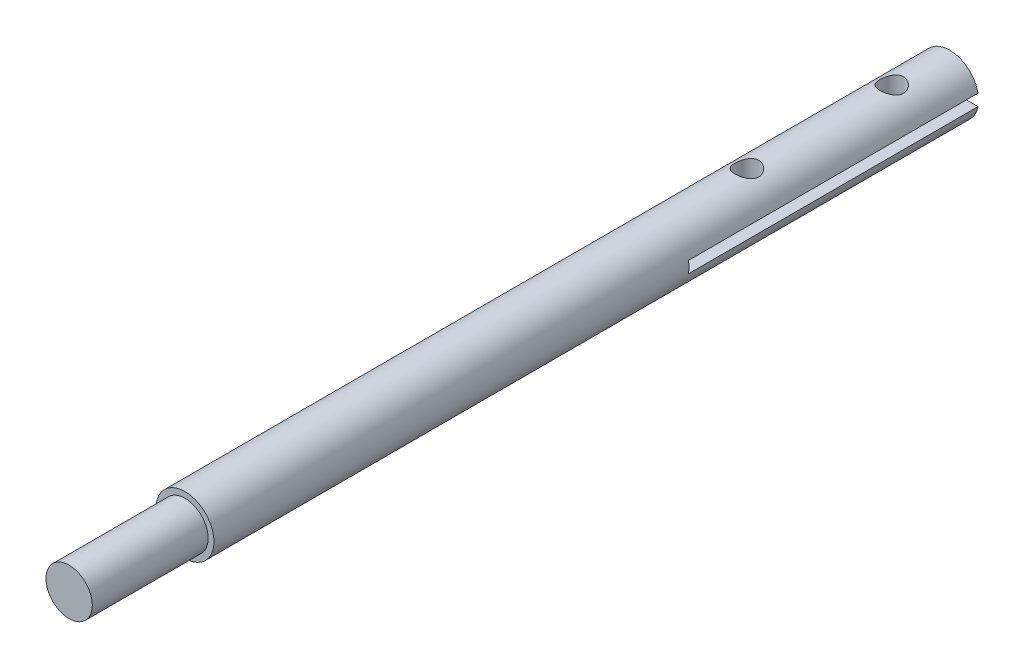
ISO-10303-21;
HEADER;
FILE_DESCRIPTION(('STEP AP214'),'2;1');
FILE_NAME('part.step','',(''),(''),'','','');
FILE_SCHEMA(('AUTOMOTIVE_DESIGN { 1 0 10303 214 1 1 1 1 }'));
ENDSEC;
DATA;
#1=APPLICATION_CONTEXT('core data for automotive mechanical design processes');
#2=APPLICATION_PROTOCOL_DEFINITION('international standard','automotive_design',2000,#1);
#3=PRODUCT_CONTEXT('',#1,'mechanical');
#4=PRODUCT('Part','Part','',(#3));
#5=PRODUCT_RELATED_PRODUCT_CATEGORY('part','',(#4));
#6=PRODUCT_DEFINITION_FORMATION('','',#4);
#7=PRODUCT_DEFINITION_CONTEXT('part definition',#1,'design');
#8=PRODUCT_DEFINITION('design','',#6,#7);
#9=PRODUCT_DEFINITION_SHAPE('','',#8);
#10=(LENGTH_UNIT() NAMED_UNIT(*) SI_UNIT(.MILLI.,.METRE.));
#11=(NAMED_UNIT(*) PLANE_ANGLE_UNIT() SI_UNIT($,.RADIAN.));
#12=(NAMED_UNIT(*) SI_UNIT($,.STERADIAN.) SOLID_ANGLE_UNIT());
#13=UNCERTAINTY_MEASURE_WITH_UNIT(LENGTH_MEASURE(1.E-05),#10,'distance_accuracy_value','');
#14=(GEOMETRIC_REPRESENTATION_CONTEXT(3) GLOBAL_UNCERTAINTY_ASSIGNED_CONTEXT((#13)) GLOBAL_UNIT_ASSIGNED_CONTEXT((#10,
#11,#12)) REPRESENTATION_CONTEXT('',''));
#15=CARTESIAN_POINT('',(0.,0.,0.));
#16=DIRECTION('',(0.,0.,1.));
#17=DIRECTION('',(1.,0.,0.));
#18=AXIS2_PLACEMENT_3D('',#15,#16,#17);
#19=CARTESIAN_POINT('',(0.,0.,152.));
#20=DIRECTION('',(0.,0.,-1.));
#21=DIRECTION('',(-1.,0.,0.));
#22=AXIS2_PLACEMENT_3D('',#19,#20,#21);
#23=CYLINDRICAL_SURFACE('',#22,5.);
#24=CARTESIAN_POINT('',(0.,5.,37.05));
#25=CARTESIAN_POINT('',(-0.109960088888995,4.99999162474761,37.0499887883828));
#26=CARTESIAN_POINT('',(-0.22010055786124,4.99633037283782,37.041100133019));
#27=CARTESIAN_POINT('',(-0.437266741365285,4.98203966344817,37.0058577990706));
#28=CARTESIAN_POINT('',(-0.544283398643791,4.97139171016134,36.9794577607932));
#29=CARTESIAN_POINT('',(-0.751707022834503,4.94427311737361,36.9103248814743));
#30=CARTESIAN_POINT('',(-0.85213478143757,4.92782195363244,36.8676466321715));
#31=CARTESIAN_POINT('',(-1.04431045171123,4.89070621857743,36.7673905713935));
#32=CARTESIAN_POINT('',(-1.1360611340093,4.87004299888606,36.7098175379704));
#33=CARTESIAN_POINT('',(-1.3129112576905,4.82544824059393,36.5784277911521));
#34=CARTESIAN_POINT('',(-1.39753009572435,4.80141189829074,36.5040000461978));
#35=CARTESIAN_POINT('',(-1.55349516200822,4.75324403175796,36.3423045644368));
#36=CARTESIAN_POINT('',(-1.6248346051593,4.72911246526888,36.2550303042697));
#37=CARTESIAN_POINT('',(-1.755544619026,4.68221302178201,36.0651127961902));
#38=CARTESIAN_POINT('',(-1.81418971857822,4.65956358527188,35.9619379531515));
#39=CARTESIAN_POINT('',(-1.9130783495842,4.61984764238022,35.7461231596069));
#40=CARTESIAN_POINT('',(-1.95333106246556,4.60277835161923,35.6334879649992));
#41=CARTESIAN_POINT('',(-2.01232406481144,4.57728595497806,35.4074786316426));
#42=CARTESIAN_POINT('',(-2.03198746852038,4.56849380770459,35.294388640851));
#43=CARTESIAN_POINT('',(-2.05212524729083,4.5594864349829,35.0661988528779));
#44=CARTESIAN_POINT('',(-2.05260973082374,4.5592666913512,34.9511001464188));
#45=CARTESIAN_POINT('',(-2.0350729213677,4.56711561624861,34.7312213081443));
#46=CARTESIAN_POINT('',(-2.01841429456452,4.57457398551408,34.6263063913018));
#47=CARTESIAN_POINT('',(-1.96934433297629,4.59591025231423,34.4209181208997));
#48=CARTESIAN_POINT('',(-1.93693009219314,4.60978933407564,34.320445590434));
#49=CARTESIAN_POINT('',(-1.85664243190718,4.64271345182265,34.1243011923068));
#50=CARTESIAN_POINT('',(-1.80845944677014,4.66186059779945,34.0287739466775));
#51=CARTESIAN_POINT('',(-1.69822024761073,4.70313793482963,33.8467972999446));
#52=CARTESIAN_POINT('',(-1.63615866376572,4.72526927919136,33.7603514316311));
#53=CARTESIAN_POINT('',(-1.49397721453326,4.77221891894988,33.5915693418189));
#54=CARTESIAN_POINT('',(-1.41279718537875,4.79710912429429,33.5101437251626));
#55=CARTESIAN_POINT('',(-1.23767977710518,4.84524390123744,33.3617623069151));
#56=CARTESIAN_POINT('',(-1.14373960235719,4.86848811051128,33.2948096845753));
#57=CARTESIAN_POINT('',(-0.94307604962629,4.91134852411871,33.1759968793123));
#58=CARTESIAN_POINT('',(-0.836119470977464,4.93087503363102,33.1244958136744));
#59=CARTESIAN_POINT('',(-0.614056114924541,4.96341578511297,33.0405347223468));
#60=CARTESIAN_POINT('',(-0.498953731554758,4.97643350796359,33.0080645174021));
#61=CARTESIAN_POINT('',(-0.271485319953805,4.99384610082279,32.9649667218565));
#62=CARTESIAN_POINT('',(-0.159387774592538,4.99872291337825,32.9531164008052));
#63=CARTESIAN_POINT('',(0.065290386269212,5.00083436123854,32.9479635357885));
#64=CARTESIAN_POINT('',(0.177870860072347,4.99807110304132,32.954655879295));
#65=CARTESIAN_POINT('',(0.394667808252847,4.98552673161979,32.9855132024052));
#66=CARTESIAN_POINT('',(0.499027059942423,4.97608675600825,33.0088292647144));
#67=CARTESIAN_POINT('',(0.702245688808083,4.95149823663536,33.071101375644));
#68=CARTESIAN_POINT('',(0.801104364199268,4.93634896636788,33.1100594147428));
#69=CARTESIAN_POINT('',(0.993959795962191,4.90121953471975,33.2037833004952));
#70=CARTESIAN_POINT('',(1.0877118542303,4.88110453737019,33.259000500707));
#71=CARTESIAN_POINT('',(1.26495296070549,4.83820450596423,33.3831775449952));
#72=CARTESIAN_POINT('',(1.34843776500182,4.81541837536033,33.452143041187));
#73=CARTESIAN_POINT('',(1.50884922434306,4.76768878573154,33.6074545106471));
#74=CARTESIAN_POINT('',(1.58492080944092,4.7427052349868,33.6946735960969));
#75=CARTESIAN_POINT('',(1.72157494851165,4.6948307682978,33.8810562450317));
#76=CARTESIAN_POINT('',(1.78215439034815,4.67194027340909,33.9802222025854));
#77=CARTESIAN_POINT('',(1.88664471859868,4.63074288498098,34.1895005166027));
#78=CARTESIAN_POINT('',(1.93034078664689,4.61249601142736,34.2997328059728));
#79=CARTESIAN_POINT('',(1.99819259878441,4.58351537382527,34.5269703528935));
#80=CARTESIAN_POINT('',(2.02236376652676,4.57277568040083,34.643970185984));
#81=CARTESIAN_POINT('',(2.04897041241061,4.56091140818714,34.8719668049263));
#82=CARTESIAN_POINT('',(2.0528999812502,4.55912616102851,34.9827557738081));
#83=CARTESIAN_POINT('',(2.0428743333798,4.56362741250793,35.2033430307127));
#84=CARTESIAN_POINT('',(2.02892166007729,4.56991276325777,35.3131414573846));
#85=CARTESIAN_POINT('',(1.9847689403231,4.58925153011183,35.5237036169474));
#86=CARTESIAN_POINT('',(1.95530467358879,4.60199754557495,35.6246525128866));
#87=CARTESIAN_POINT('',(1.88167179572287,4.63259024015567,35.8202044274074));
#88=CARTESIAN_POINT('',(1.83749908043773,4.65043834273087,35.9148056659159));
#89=CARTESIAN_POINT('',(1.73269683899259,4.69053110841601,36.1010660592811));
#90=CARTESIAN_POINT('',(1.67124993123014,4.71297307906766,36.1922220796592));
#91=CARTESIAN_POINT('',(1.53480828300677,4.75915396420042,36.3633973622575));
#92=CARTESIAN_POINT('',(1.45980908855853,4.78289330326979,36.4434129477978));
#93=CARTESIAN_POINT('',(1.29219113304724,4.8309783179901,36.5957566799648));
#94=CARTESIAN_POINT('',(1.19870962499975,4.85525129768707,36.6671628716104));
#95=CARTESIAN_POINT('',(1.00018198070987,4.89999732517489,36.7933104628778));
#96=CARTESIAN_POINT('',(0.895130570546059,4.92046862852728,36.8480442195198));
#97=CARTESIAN_POINT('',(0.678204217797162,4.95498686486783,36.938064817949));
#98=CARTESIAN_POINT('',(0.566480373896989,4.96913969112491,36.9736744080793));
#99=CARTESIAN_POINT('',(0.338135516339043,4.9898597892694,37.0252842715524));
#100=CARTESIAN_POINT('',(0.221531130647042,4.99645094005013,37.041346283702));
#101=CARTESIAN_POINT('',(0.0697228525015928,4.99963796102132,37.0491143522945));
#102=CARTESIAN_POINT('',(0.0348704961962966,5.00000265595644,37.0500035554233));
#103=CARTESIAN_POINT('',(0.,5.,37.05));
#104=B_SPLINE_CURVE_WITH_KNOTS('',3,(#24,#25,#26,#27,#28,#29,#30,#31,#32,#33,#34,#35,#36,#37,
#38,#39,#40,#41,#42,#43,#44,#45,#46,#47,#48,#49,#50,#51,#52,#53,#54,#55,#56,#57,#58,#59,#60,#61,
#62,#63,#64,#65,#66,#67,#68,#69,#70,#71,#72,#73,#74,#75,#76,#77,#78,#79,#80,#81,#82,#83,#84,#85,
#86,#87,#88,#89,#90,#91,#92,#93,#94,#95,#96,#97,#98,#99,#100,#101,#102,#103),.UNSPECIFIED.,.T.,
.F.,(4,2,2,2,2,2,2,2,2,2,2,2,2,2,2,2,2,2,2,2,2,2,2,2,2,2,2,2,2,2,2,2,2,2,2,2,2,2,2,4),(0.,
0.32978342689205,0.660443426826358,0.990004116450424,1.31945921811745,1.66364022554888,
2.00799661221837,2.36863620751076,2.72909557531711,3.07259406382618,3.41591150507755,
3.73389996746568,4.05194710257311,4.37665557788593,4.70148990545885,5.05282452028155,
5.40423623377219,5.76327522208258,6.12212199141179,6.45885503955892,6.79549525391494,
7.11607316626805,7.43669188585171,7.76721987322439,8.09788402651641,8.45145691735235,
8.80510077991834,9.16310673123037,9.52082959918418,9.85172568562769,10.1825747136438,
10.4989822282431,10.8154781053062,11.1506527276499,11.4859377068484,11.8445460682332,
12.2033185763632,12.5558291489523,12.9072234431145,13.0118042219155),.UNSPECIFIED.);
#105=CARTESIAN_POINT('',(0.,5.,37.05));
#106=VERTEX_POINT('',#105);
#107=EDGE_CURVE('E99',#106,#106,#104,.T.);
#108=ORIENTED_EDGE('',*,*,#107,.T.);
#109=EDGE_LOOP('',(#108));
#110=FACE_BOUND('',#109,.T.);
#111=CARTESIAN_POINT('',(0.,-5.,37.05));
#112=CARTESIAN_POINT('',(0.109960088888995,-4.99999162474761,37.0499887883828));
#113=CARTESIAN_POINT('',(0.22010055786124,-4.99633037283782,37.041100133019));
#114=CARTESIAN_POINT('',(0.437266741365285,-4.98203966344817,37.0058577990706));
#115=CARTESIAN_POINT('',(0.544283398643791,-4.97139171016134,36.9794577607932));
#116=CARTESIAN_POINT('',(0.751707022834503,-4.94427311737361,36.9103248814743));
#117=CARTESIAN_POINT('',(0.85213478143757,-4.92782195363244,36.8676466321715));
#118=CARTESIAN_POINT('',(1.04431045171123,-4.89070621857743,36.7673905713935));
#119=CARTESIAN_POINT('',(1.1360611340093,-4.87004299888606,36.7098175379704));
#120=CARTESIAN_POINT('',(1.3129112576905,-4.82544824059393,36.5784277911521));
#121=CARTESIAN_POINT('',(1.39753009572435,-4.80141189829074,36.5040000461978));
#122=CARTESIAN_POINT('',(1.55349516200822,-4.75324403175796,36.3423045644368));
#123=CARTESIAN_POINT('',(1.6248346051593,-4.72911246526888,36.2550303042697));
#124=CARTESIAN_POINT('',(1.755544619026,-4.68221302178201,36.0651127961902));
#125=CARTESIAN_POINT('',(1.81418971857822,-4.65956358527188,35.9619379531515));
#126=CARTESIAN_POINT('',(1.9130783495842,-4.61984764238022,35.7461231596069));
#127=CARTESIAN_POINT('',(1.95333106246556,-4.60277835161923,35.6334879649992));
#128=CARTESIAN_POINT('',(2.01232406481144,-4.57728595497806,35.4074786316426));
#129=CARTESIAN_POINT('',(2.03198746852038,-4.56849380770459,35.294388640851));
#130=CARTESIAN_POINT('',(2.05212524729083,-4.5594864349829,35.0661988528779));
#131=CARTESIAN_POINT('',(2.05260973082374,-4.5592666913512,34.9511001464188));
#132=CARTESIAN_POINT('',(2.0350729213677,-4.56711561624861,34.7312213081443));
#133=CARTESIAN_POINT('',(2.01841429456452,-4.57457398551408,34.6263063913018));
#134=CARTESIAN_POINT('',(1.96934433297629,-4.59591025231423,34.4209181208997));
#135=CARTESIAN_POINT('',(1.93693009219314,-4.60978933407564,34.320445590434));
#136=CARTESIAN_POINT('',(1.85664243190718,-4.64271345182265,34.1243011923068));
#137=CARTESIAN_POINT('',(1.80845944677014,-4.66186059779945,34.0287739466775));
#138=CARTESIAN_POINT('',(1.69822024761073,-4.70313793482963,33.8467972999446));
#139=CARTESIAN_POINT('',(1.63615866376572,-4.72526927919136,33.7603514316311));
#140=CARTESIAN_POINT('',(1.49397721453326,-4.77221891894988,33.5915693418189));
#141=CARTESIAN_POINT('',(1.41279718537875,-4.79710912429429,33.5101437251626));
#142=CARTESIAN_POINT('',(1.23767977710518,-4.84524390123744,33.3617623069151));
#143=CARTESIAN_POINT('',(1.14373960235719,-4.86848811051128,33.2948096845753));
#144=CARTESIAN_POINT('',(0.94307604962629,-4.91134852411871,33.1759968793123));
#145=CARTESIAN_POINT('',(0.836119470977464,-4.93087503363102,33.1244958136744));
#146=CARTESIAN_POINT('',(0.614056114924541,-4.96341578511297,33.0405347223468));
#147=CARTESIAN_POINT('',(0.498953731554758,-4.97643350796359,33.0080645174021));
#148=CARTESIAN_POINT('',(0.271485319953805,-4.99384610082279,32.9649667218565));
#149=CARTESIAN_POINT('',(0.159387774592538,-4.99872291337825,32.9531164008052));
#150=CARTESIAN_POINT('',(-0.065290386269212,-5.00083436123854,32.9479635357885));
#151=CARTESIAN_POINT('',(-0.177870860072347,-4.99807110304132,32.954655879295));
#152=CARTESIAN_POINT('',(-0.394667808252847,-4.98552673161979,32.9855132024052));
#153=CARTESIAN_POINT('',(-0.499027059942423,-4.97608675600825,33.0088292647144));
#154=CARTESIAN_POINT('',(-0.702245688808083,-4.95149823663536,33.071101375644));
#155=CARTESIAN_POINT('',(-0.801104364199268,-4.93634896636788,33.1100594147428));
#156=CARTESIAN_POINT('',(-0.993959795962191,-4.90121953471975,33.2037833004952));
#157=CARTESIAN_POINT('',(-1.0877118542303,-4.88110453737019,33.259000500707));
#158=CARTESIAN_POINT('',(-1.26495296070549,-4.83820450596423,33.3831775449952));
#159=CARTESIAN_POINT('',(-1.34843776500182,-4.81541837536033,33.452143041187));
#160=CARTESIAN_POINT('',(-1.50884922434306,-4.76768878573154,33.6074545106471));
#161=CARTESIAN_POINT('',(-1.58492080944092,-4.7427052349868,33.6946735960969));
#162=CARTESIAN_POINT('',(-1.72157494851165,-4.6948307682978,33.8810562450317));
#163=CARTESIAN_POINT('',(-1.78215439034815,-4.67194027340909,33.9802222025854));
#164=CARTESIAN_POINT('',(-1.88664471859868,-4.63074288498098,34.1895005166027));
#165=CARTESIAN_POINT('',(-1.93034078664689,-4.61249601142736,34.2997328059728));
#166=CARTESIAN_POINT('',(-1.99819259878441,-4.58351537382527,34.5269703528935));
#167=CARTESIAN_POINT('',(-2.02236376652676,-4.57277568040083,34.643970185984));
#168=CARTESIAN_POINT('',(-2.04897041241061,-4.56091140818714,34.8719668049263));
#169=CARTESIAN_POINT('',(-2.0528999812502,-4.55912616102851,34.9827557738081));
#170=CARTESIAN_POINT('',(-2.0428743333798,-4.56362741250793,35.2033430307127));
#171=CARTESIAN_POINT('',(-2.02892166007729,-4.56991276325777,35.3131414573846));
#172=CARTESIAN_POINT('',(-1.9847689403231,-4.58925153011183,35.5237036169474));
#173=CARTESIAN_POINT('',(-1.95530467358879,-4.60199754557495,35.6246525128866));
#174=CARTESIAN_POINT('',(-1.88167179572287,-4.63259024015567,35.8202044274074));
#175=CARTESIAN_POINT('',(-1.83749908043773,-4.65043834273087,35.9148056659159));
#176=CARTESIAN_POINT('',(-1.73269683899259,-4.69053110841601,36.1010660592811));
#177=CARTESIAN_POINT('',(-1.67124993123014,-4.71297307906766,36.1922220796592));
#178=CARTESIAN_POINT('',(-1.53480828300677,-4.75915396420042,36.3633973622575));
#179=CARTESIAN_POINT('',(-1.45980908855853,-4.78289330326979,36.4434129477978));
#180=CARTESIAN_POINT('',(-1.29219113304724,-4.8309783179901,36.5957566799648));
#181=CARTESIAN_POINT('',(-1.19870962499975,-4.85525129768707,36.6671628716104));
#182=CARTESIAN_POINT('',(-1.00018198070987,-4.89999732517489,36.7933104628778));
#183=CARTESIAN_POINT('',(-0.895130570546059,-4.92046862852728,36.8480442195198));
#184=CARTESIAN_POINT('',(-0.678204217797162,-4.95498686486783,36.938064817949));
#185=CARTESIAN_POINT('',(-0.566480373896989,-4.96913969112491,36.9736744080793));
#186=CARTESIAN_POINT('',(-0.338135516339043,-4.9898597892694,37.0252842715524));
#187=CARTESIAN_POINT('',(-0.221531130647042,-4.99645094005013,37.041346283702));
#188=CARTESIAN_POINT('',(-0.0697228525015928,-4.99963796102132,37.0491143522945));
#189=CARTESIAN_POINT('',(-0.0348704961962966,-5.00000265595644,37.0500035554233));
#190=CARTESIAN_POINT('',(0.,-5.,37.05));
#191=B_SPLINE_CURVE_WITH_KNOTS('',3,(#111,#112,#113,#114,#115,#116,#117,#118,#119,#120,#121,
#122,#123,#124,#125,#126,#127,#128,#129,#130,#131,#132,#133,#134,#135,#136,#137,#138,#139,#140,
#141,#142,#143,#144,#145,#146,#147,#148,#149,#150,#151,#152,#153,#154,#155,#156,#157,#158,#159,
#160,#161,#162,#163,#164,#165,#166,#167,#168,#169,#170,#171,#172,#173,#174,#175,#176,#177,#178,
#179,#180,#181,#182,#183,#184,#185,#186,#187,#188,#189,#190),.UNSPECIFIED.,.T.,.F.,(4,2,2,2,2,2,
2,2,2,2,2,2,2,2,2,2,2,2,2,2,2,2,2,2,2,2,2,2,2,2,2,2,2,2,2,2,2,2,2,4),(0.,0.32978342689205,
0.660443426826358,0.990004116450424,1.31945921811745,1.66364022554888,2.00799661221837,
2.36863620751076,2.72909557531711,3.07259406382618,3.41591150507755,3.73389996746568,
4.05194710257311,4.37665557788593,4.70148990545885,5.05282452028155,5.40423623377219,
5.76327522208258,6.12212199141179,6.45885503955892,6.79549525391494,7.11607316626805,
7.43669188585171,7.76721987322439,8.09788402651641,8.45145691735235,8.80510077991834,
9.16310673123037,9.52082959918418,9.85172568562769,10.1825747136438,10.4989822282431,
10.8154781053062,11.1506527276499,11.4859377068484,11.8445460682332,12.2033185763632,
12.5558291489523,12.9072234431145,13.0118042219155),.UNSPECIFIED.);
#192=CARTESIAN_POINT('',(0.,-5.,37.05));
#193=VERTEX_POINT('',#192);
#194=EDGE_CURVE('E110',#193,#193,#191,.T.);
#195=ORIENTED_EDGE('',*,*,#194,.T.);
#196=EDGE_LOOP('',(#195));
#197=FACE_BOUND('',#196,.T.);
#198=CARTESIAN_POINT('',(0.,5.,12.05));
#199=CARTESIAN_POINT('',(-0.109960088888996,4.99999162474761,12.0499887883828));
#200=CARTESIAN_POINT('',(-0.22010055786124,4.99633037283782,12.041100133019));
#201=CARTESIAN_POINT('',(-0.437266741365286,4.98203966344817,12.0058577990706));
#202=CARTESIAN_POINT('',(-0.544283398643791,4.97139171016134,11.9794577607931));
#203=CARTESIAN_POINT('',(-0.751707022834502,4.94427311737361,11.9103248814743));
#204=CARTESIAN_POINT('',(-0.852134781437569,4.92782195363243,11.8676466321715));
#205=CARTESIAN_POINT('',(-1.04431045171123,4.89070621857743,11.7673905713935));
#206=CARTESIAN_POINT('',(-1.1360611340093,4.87004299888606,11.7098175379704));
#207=CARTESIAN_POINT('',(-1.3129112576905,4.82544824059393,11.5784277911521));
#208=CARTESIAN_POINT('',(-1.39753009572435,4.80141189829074,11.5040000461978));
#209=CARTESIAN_POINT('',(-1.55349516200822,4.75324403175796,11.3423045644368));
#210=CARTESIAN_POINT('',(-1.6248346051593,4.72911246526888,11.2550303042697));
#211=CARTESIAN_POINT('',(-1.755544619026,4.68221302178202,11.0651127961902));
#212=CARTESIAN_POINT('',(-1.81418971857822,4.65956358527188,10.9619379531515));
#213=CARTESIAN_POINT('',(-1.9130783495842,4.61984764238022,10.7461231596069));
#214=CARTESIAN_POINT('',(-1.95333106246556,4.60277835161923,10.6334879649992));
#215=CARTESIAN_POINT('',(-2.01232406481144,4.57728595497806,10.4074786316426));
#216=CARTESIAN_POINT('',(-2.03198746852038,4.56849380770459,10.294388640851));
#217=CARTESIAN_POINT('',(-2.05212524729083,4.5594864349829,10.0661988528779));
#218=CARTESIAN_POINT('',(-2.05260973082374,4.5592666913512,9.95110014641878));
#219=CARTESIAN_POINT('',(-2.0350729213677,4.56711561624861,9.73122130814426));
#220=CARTESIAN_POINT('',(-2.01841429456452,4.57457398551408,9.62630639130181));
#221=CARTESIAN_POINT('',(-1.96934433297629,4.59591025231423,9.42091812089967));
#222=CARTESIAN_POINT('',(-1.93693009219314,4.60978933407563,9.32044559043395));
#223=CARTESIAN_POINT('',(-1.85664243190717,4.64271345182265,9.12430119230675));
#224=CARTESIAN_POINT('',(-1.80845944677014,4.66186059779945,9.02877394667753));
#225=CARTESIAN_POINT('',(-1.69822024761072,4.70313793482963,8.84679729994459));
#226=CARTESIAN_POINT('',(-1.63615866376572,4.72526927919136,8.76035143163108));
#227=CARTESIAN_POINT('',(-1.49397721453325,4.77221891894988,8.5915693418189));
#228=CARTESIAN_POINT('',(-1.41279718537875,4.79710912429429,8.51014372516264));
#229=CARTESIAN_POINT('',(-1.23767977710517,4.84524390123745,8.3617623069151));
#230=CARTESIAN_POINT('',(-1.14373960235718,4.86848811051128,8.29480968457532));
#231=CARTESIAN_POINT('',(-0.943076049626286,4.91134852411871,8.1759968793123));
#232=CARTESIAN_POINT('',(-0.836119470977461,4.93087503363102,8.12449581367438));
#233=CARTESIAN_POINT('',(-0.61405611492454,4.96341578511297,8.04053472234676));
#234=CARTESIAN_POINT('',(-0.498953731554758,4.97643350796359,8.00806451740208));
#235=CARTESIAN_POINT('',(-0.271485319953805,4.99384610082279,7.9649667218565));
#236=CARTESIAN_POINT('',(-0.159387774592537,4.99872291337825,7.95311640080518));
#237=CARTESIAN_POINT('',(0.0652903862692128,5.00083436123854,7.9479635357885));
#238=CARTESIAN_POINT('',(0.177870860072348,4.99807110304132,7.95465587929504));
#239=CARTESIAN_POINT('',(0.394667808252848,4.98552673161979,7.98551320240521));
#240=CARTESIAN_POINT('',(0.499027059942425,4.97608675600825,8.0088292647144));
#241=CARTESIAN_POINT('',(0.702245688808085,4.95149823663536,8.07110137564398));
#242=CARTESIAN_POINT('',(0.80110436419927,4.93634896636788,8.11005941474278));
#243=CARTESIAN_POINT('',(0.993959795962192,4.90121953471975,8.20378330049516));
#244=CARTESIAN_POINT('',(1.0877118542303,4.88110453737019,8.25900050070698));
#245=CARTESIAN_POINT('',(1.26495296070549,4.83820450596423,8.38317754499523));
#246=CARTESIAN_POINT('',(1.34843776500182,4.81541837536033,8.45214304118698));
#247=CARTESIAN_POINT('',(1.50884922434306,4.76768878573154,8.60745451064707));
#248=CARTESIAN_POINT('',(1.58492080944093,4.7427052349868,8.69467359609686));
#249=CARTESIAN_POINT('',(1.72157494851165,4.6948307682978,8.88105624503172));
#250=CARTESIAN_POINT('',(1.78215439034816,4.67194027340909,8.98022220258536));
#251=CARTESIAN_POINT('',(1.88664471859869,4.63074288498098,9.18950051660267));
#252=CARTESIAN_POINT('',(1.9303407866469,4.61249601142736,9.29973280597279));
#253=CARTESIAN_POINT('',(1.99819259878441,4.58351537382527,9.52697035289354));
#254=CARTESIAN_POINT('',(2.02236376652676,4.57277568040083,9.64397018598402));
#255=CARTESIAN_POINT('',(2.04897041241061,4.56091140818714,9.87196680492629));
#256=CARTESIAN_POINT('',(2.0528999812502,4.55912616102851,9.9827557738081));
#257=CARTESIAN_POINT('',(2.0428743333798,4.56362741250793,10.2033430307127));
#258=CARTESIAN_POINT('',(2.02892166007729,4.56991276325777,10.3131414573846));
#259=CARTESIAN_POINT('',(1.9847689403231,4.58925153011183,10.5237036169474));
#260=CARTESIAN_POINT('',(1.95530467358879,4.60199754557495,10.6246525128866));
#261=CARTESIAN_POINT('',(1.88167179572287,4.63259024015567,10.8202044274074));
#262=CARTESIAN_POINT('',(1.83749908043773,4.65043834273087,10.9148056659159));
#263=CARTESIAN_POINT('',(1.73269683899259,4.69053110841601,11.1010660592811));
#264=CARTESIAN_POINT('',(1.67124993123014,4.71297307906766,11.1922220796592));
#265=CARTESIAN_POINT('',(1.53480828300677,4.75915396420042,11.3633973622575));
#266=CARTESIAN_POINT('',(1.45980908855853,4.78289330326979,11.4434129477978));
#267=CARTESIAN_POINT('',(1.29219113304724,4.8309783179901,11.5957566799648));
#268=CARTESIAN_POINT('',(1.19870962499975,4.85525129768707,11.6671628716103));
#269=CARTESIAN_POINT('',(1.00018198070987,4.89999732517489,11.7933104628778));
#270=CARTESIAN_POINT('',(0.895130570546057,4.92046862852728,11.8480442195198));
#271=CARTESIAN_POINT('',(0.67820421779716,4.95498686486783,11.938064817949));
#272=CARTESIAN_POINT('',(0.566480373896988,4.96913969112491,11.9736744080793));
#273=CARTESIAN_POINT('',(0.338135516339043,4.9898597892694,12.0252842715524));
#274=CARTESIAN_POINT('',(0.221531130647043,4.99645094005013,12.041346283702));
#275=CARTESIAN_POINT('',(0.069722852501594,4.99963796102132,12.0491143522945));
#276=CARTESIAN_POINT('',(0.0348704961962972,5.00000265595644,12.0500035554232));
#277=CARTESIAN_POINT('',(0.,5.,12.05));
#278=B_SPLINE_CURVE_WITH_KNOTS('',3,(#198,#199,#200,#201,#202,#203,#204,#205,#206,#207,#208,
#209,#210,#211,#212,#213,#214,#215,#216,#217,#218,#219,#220,#221,#222,#223,#224,#225,#226,#227,
#228,#229,#230,#231,#232,#233,#234,#235,#236,#237,#238,#239,#240,#241,#242,#243,#244,#245,#246,
#247,#248,#249,#250,#251,#252,#253,#254,#255,#256,#257,#258,#259,#260,#261,#262,#263,#264,#265,
#266,#267,#268,#269,#270,#271,#272,#273,#274,#275,#276,#277),.UNSPECIFIED.,.T.,.F.,(4,2,2,2,2,2,
2,2,2,2,2,2,2,2,2,2,2,2,2,2,2,2,2,2,2,2,2,2,2,2,2,2,2,2,2,2,2,2,2,4),(0.,0.32978342689205,
0.660443426826358,0.990004116450421,1.31945921811745,1.66364022554888,2.00799661221837,
2.36863620751076,2.72909557531711,3.07259406382617,3.41591150507755,3.73389996746567,
4.05194710257311,4.37665557788595,4.70148990545886,5.05282452028155,5.40423623377219,
5.76327522208258,6.12212199141179,6.45885503955892,6.79549525391494,7.11607316626805,
7.43669188585171,7.76721987322439,8.09788402651641,8.45145691735235,8.80510077991834,
9.16310673123039,9.52082959918418,9.85172568562768,10.1825747136438,10.4989822282431,
10.8154781053062,11.1506527276499,11.4859377068484,11.8445460682331,12.2033185763632,
12.5558291489523,12.9072234431144,13.0118042219155),.UNSPECIFIED.);
#279=CARTESIAN_POINT('',(0.,5.,12.05));
#280=VERTEX_POINT('',#279);
#281=EDGE_CURVE('E151',#280,#280,#278,.T.);
#282=ORIENTED_EDGE('',*,*,#281,.T.);
#283=EDGE_LOOP('',(#282));
#284=FACE_BOUND('',#283,.T.);
#285=CARTESIAN_POINT('',(0.,-5.,12.05));
#286=CARTESIAN_POINT('',(0.109960088888996,-4.99999162474761,12.0499887883828));
#287=CARTESIAN_POINT('',(0.22010055786124,-4.99633037283782,12.041100133019));
#288=CARTESIAN_POINT('',(0.437266741365286,-4.98203966344817,12.0058577990706));
#289=CARTESIAN_POINT('',(0.544283398643791,-4.97139171016134,11.9794577607931));
#290=CARTESIAN_POINT('',(0.751707022834502,-4.94427311737361,11.9103248814743));
#291=CARTESIAN_POINT('',(0.852134781437569,-4.92782195363243,11.8676466321715));
#292=CARTESIAN_POINT('',(1.04431045171123,-4.89070621857743,11.7673905713935));
#293=CARTESIAN_POINT('',(1.1360611340093,-4.87004299888606,11.7098175379704));
#294=CARTESIAN_POINT('',(1.3129112576905,-4.82544824059393,11.5784277911521));
#295=CARTESIAN_POINT('',(1.39753009572435,-4.80141189829074,11.5040000461978));
#296=CARTESIAN_POINT('',(1.55349516200822,-4.75324403175796,11.3423045644368));
#297=CARTESIAN_POINT('',(1.6248346051593,-4.72911246526888,11.2550303042697));
#298=CARTESIAN_POINT('',(1.755544619026,-4.68221302178202,11.0651127961902));
#299=CARTESIAN_POINT('',(1.81418971857822,-4.65956358527188,10.9619379531515));
#300=CARTESIAN_POINT('',(1.9130783495842,-4.61984764238022,10.7461231596069));
#301=CARTESIAN_POINT('',(1.95333106246556,-4.60277835161923,10.6334879649992));
#302=CARTESIAN_POINT('',(2.01232406481144,-4.57728595497806,10.4074786316426));
#303=CARTESIAN_POINT('',(2.03198746852038,-4.56849380770459,10.294388640851));
#304=CARTESIAN_POINT('',(2.05212524729083,-4.5594864349829,10.0661988528779));
#305=CARTESIAN_POINT('',(2.05260973082374,-4.5592666913512,9.95110014641878));
#306=CARTESIAN_POINT('',(2.0350729213677,-4.56711561624861,9.73122130814426));
#307=CARTESIAN_POINT('',(2.01841429456452,-4.57457398551408,9.62630639130181));
#308=CARTESIAN_POINT('',(1.96934433297629,-4.59591025231423,9.42091812089967));
#309=CARTESIAN_POINT('',(1.93693009219314,-4.60978933407563,9.32044559043395));
#310=CARTESIAN_POINT('',(1.85664243190717,-4.64271345182265,9.12430119230675));
#311=CARTESIAN_POINT('',(1.80845944677014,-4.66186059779945,9.02877394667753));
#312=CARTESIAN_POINT('',(1.69822024761072,-4.70313793482963,8.84679729994459));
#313=CARTESIAN_POINT('',(1.63615866376572,-4.72526927919136,8.76035143163108));
#314=CARTESIAN_POINT('',(1.49397721453325,-4.77221891894988,8.5915693418189));
#315=CARTESIAN_POINT('',(1.41279718537875,-4.79710912429429,8.51014372516264));
#316=CARTESIAN_POINT('',(1.23767977710517,-4.84524390123745,8.3617623069151));
#317=CARTESIAN_POINT('',(1.14373960235718,-4.86848811051128,8.29480968457532));
#318=CARTESIAN_POINT('',(0.943076049626286,-4.91134852411871,8.1759968793123));
#319=CARTESIAN_POINT('',(0.836119470977461,-4.93087503363102,8.12449581367438));
#320=CARTESIAN_POINT('',(0.61405611492454,-4.96341578511297,8.04053472234676));
#321=CARTESIAN_POINT('',(0.498953731554758,-4.97643350796359,8.00806451740208));
#322=CARTESIAN_POINT('',(0.271485319953805,-4.99384610082279,7.9649667218565));
#323=CARTESIAN_POINT('',(0.159387774592537,-4.99872291337825,7.95311640080518));
#324=CARTESIAN_POINT('',(-0.0652903862692128,-5.00083436123854,7.9479635357885));
#325=CARTESIAN_POINT('',(-0.177870860072348,-4.99807110304132,7.95465587929504));
#326=CARTESIAN_POINT('',(-0.394667808252848,-4.98552673161979,7.98551320240521));
#327=CARTESIAN_POINT('',(-0.499027059942425,-4.97608675600825,8.0088292647144));
#328=CARTESIAN_POINT('',(-0.702245688808085,-4.95149823663536,8.07110137564398));
#329=CARTESIAN_POINT('',(-0.80110436419927,-4.93634896636788,8.11005941474278));
#330=CARTESIAN_POINT('',(-0.993959795962192,-4.90121953471975,8.20378330049516));
#331=CARTESIAN_POINT('',(-1.0877118542303,-4.88110453737019,8.25900050070698));
#332=CARTESIAN_POINT('',(-1.26495296070549,-4.83820450596423,8.38317754499523));
#333=CARTESIAN_POINT('',(-1.34843776500182,-4.81541837536033,8.45214304118698));
#334=CARTESIAN_POINT('',(-1.50884922434306,-4.76768878573154,8.60745451064707));
#335=CARTESIAN_POINT('',(-1.58492080944093,-4.7427052349868,8.69467359609686));
#336=CARTESIAN_POINT('',(-1.72157494851165,-4.6948307682978,8.88105624503172));
#337=CARTESIAN_POINT('',(-1.78215439034816,-4.67194027340909,8.98022220258536));
#338=CARTESIAN_POINT('',(-1.88664471859869,-4.63074288498098,9.18950051660267));
#339=CARTESIAN_POINT('',(-1.9303407866469,-4.61249601142736,9.29973280597279));
#340=CARTESIAN_POINT('',(-1.99819259878441,-4.58351537382527,9.52697035289354));
#341=CARTESIAN_POINT('',(-2.02236376652676,-4.57277568040083,9.64397018598402));
#342=CARTESIAN_POINT('',(-2.04897041241061,-4.56091140818714,9.87196680492629));
#343=CARTESIAN_POINT('',(-2.0528999812502,-4.55912616102851,9.9827557738081));
#344=CARTESIAN_POINT('',(-2.0428743333798,-4.56362741250793,10.2033430307127));
#345=CARTESIAN_POINT('',(-2.02892166007729,-4.56991276325777,10.3131414573846));
#346=CARTESIAN_POINT('',(-1.9847689403231,-4.58925153011183,10.5237036169474));
#347=CARTESIAN_POINT('',(-1.95530467358879,-4.60199754557495,10.6246525128866));
#348=CARTESIAN_POINT('',(-1.88167179572287,-4.63259024015567,10.8202044274074));
#349=CARTESIAN_POINT('',(-1.83749908043773,-4.65043834273087,10.9148056659159));
#350=CARTESIAN_POINT('',(-1.73269683899259,-4.69053110841601,11.1010660592811));
#351=CARTESIAN_POINT('',(-1.67124993123014,-4.71297307906766,11.1922220796592));
#352=CARTESIAN_POINT('',(-1.53480828300677,-4.75915396420042,11.3633973622575));
#353=CARTESIAN_POINT('',(-1.45980908855853,-4.78289330326979,11.4434129477978));
#354=CARTESIAN_POINT('',(-1.29219113304724,-4.8309783179901,11.5957566799648));
#355=CARTESIAN_POINT('',(-1.19870962499975,-4.85525129768707,11.6671628716103));
#356=CARTESIAN_POINT('',(-1.00018198070987,-4.89999732517489,11.7933104628778));
#357=CARTESIAN_POINT('',(-0.895130570546057,-4.92046862852728,11.8480442195198));
#358=CARTESIAN_POINT('',(-0.67820421779716,-4.95498686486783,11.938064817949));
#359=CARTESIAN_POINT('',(-0.566480373896988,-4.96913969112491,11.9736744080793));
#360=CARTESIAN_POINT('',(-0.338135516339043,-4.9898597892694,12.0252842715524));
#361=CARTESIAN_POINT('',(-0.221531130647043,-4.99645094005013,12.041346283702));
#362=CARTESIAN_POINT('',(-0.069722852501594,-4.99963796102132,12.0491143522945));
#363=CARTESIAN_POINT('',(-0.0348704961962972,-5.00000265595644,12.0500035554232));
#364=CARTESIAN_POINT('',(0.,-5.,12.05));
#365=B_SPLINE_CURVE_WITH_KNOTS('',3,(#285,#286,#287,#288,#289,#290,#291,#292,#293,#294,#295,
#296,#297,#298,#299,#300,#301,#302,#303,#304,#305,#306,#307,#308,#309,#310,#311,#312,#313,#314,
#315,#316,#317,#318,#319,#320,#321,#322,#323,#324,#325,#326,#327,#328,#329,#330,#331,#332,#333,
#334,#335,#336,#337,#338,#339,#340,#341,#342,#343,#344,#345,#346,#347,#348,#349,#350,#351,#352,
#353,#354,#355,#356,#357,#358,#359,#360,#361,#362,#363,#364),.UNSPECIFIED.,.T.,.F.,(4,2,2,2,2,2,
2,2,2,2,2,2,2,2,2,2,2,2,2,2,2,2,2,2,2,2,2,2,2,2,2,2,2,2,2,2,2,2,2,4),(0.,0.32978342689205,
0.660443426826358,0.990004116450421,1.31945921811745,1.66364022554888,2.00799661221837,
2.36863620751076,2.72909557531711,3.07259406382617,3.41591150507755,3.73389996746567,
4.05194710257311,4.37665557788595,4.70148990545886,5.05282452028155,5.40423623377219,
5.76327522208258,6.12212199141179,6.45885503955892,6.79549525391494,7.11607316626805,
7.43669188585171,7.76721987322439,8.09788402651641,8.45145691735235,8.80510077991834,
9.16310673123039,9.52082959918418,9.85172568562768,10.1825747136438,10.4989822282431,
10.8154781053062,11.1506527276499,11.4859377068484,11.8445460682331,12.2033185763632,
12.5558291489523,12.9072234431144,13.0118042219155),.UNSPECIFIED.);
#366=CARTESIAN_POINT('',(0.,-5.,12.05));
#367=VERTEX_POINT('',#366);
#368=EDGE_CURVE('E154',#367,#367,#365,.T.);
#369=ORIENTED_EDGE('',*,*,#368,.T.);
#370=EDGE_LOOP('',(#369));
#371=FACE_BOUND('',#370,.T.);
#372=CARTESIAN_POINT('',(0.,0.,50.));
#373=DIRECTION('',(0.,0.,-1.));
#374=DIRECTION('',(-1.,0.,0.));
#375=AXIS2_PLACEMENT_3D('',#372,#373,#374);
#376=CIRCLE('',#375,5.);
#377=CARTESIAN_POINT('',(4.89897948556635,1.,50.));
#378=VERTEX_POINT('',#377);
#379=CARTESIAN_POINT('',(4.89897948556635,-1.,50.));
#380=VERTEX_POINT('',#379);
#381=EDGE_CURVE('E12',#378,#380,#376,.T.);
#382=ORIENTED_EDGE('',*,*,#381,.F.);
#383=DIRECTION('',(0.,0.,-1.));
#384=VECTOR('',#383,1.);
#385=CARTESIAN_POINT('',(4.89897948556635,1.,152.));
#386=LINE('',#385,#384);
#387=CARTESIAN_POINT('',(4.89897948556635,1.,0.));
#388=VERTEX_POINT('',#387);
#389=EDGE_CURVE('E61',#378,#388,#386,.T.);
#390=ORIENTED_EDGE('',*,*,#389,.T.);
#391=CARTESIAN_POINT('',(0.,0.,0.));
#392=DIRECTION('',(0.,0.,1.));
#393=DIRECTION('',(1.,0.,0.));
#394=AXIS2_PLACEMENT_3D('',#391,#392,#393);
#395=CIRCLE('',#394,5.);
#396=CARTESIAN_POINT('',(-4.89897948556636,1.,0.));
#397=VERTEX_POINT('',#396);
#398=EDGE_CURVE('E96',#388,#397,#395,.T.);
#399=ORIENTED_EDGE('',*,*,#398,.T.);
#400=DIRECTION('',(0.,0.,-1.));
#401=VECTOR('',#400,1.);
#402=CARTESIAN_POINT('',(-4.89897948556635,1.,152.));
#403=LINE('',#402,#401);
#404=CARTESIAN_POINT('',(-4.89897948556635,1.,50.));
#405=VERTEX_POINT('',#404);
#406=EDGE_CURVE('E100',#397,#405,#403,.F.);
#407=ORIENTED_EDGE('',*,*,#406,.T.);
#408=CARTESIAN_POINT('',(-4.89897948556635,-1.,50.));
#409=VERTEX_POINT('',#408);
#410=EDGE_CURVE('E46',#409,#405,#376,.T.);
#411=ORIENTED_EDGE('',*,*,#410,.F.);
#412=DIRECTION('',(0.,0.,-1.));
#413=VECTOR('',#412,1.);
#414=CARTESIAN_POINT('',(-4.89897948556635,-1.,152.));
#415=LINE('',#414,#413);
#416=CARTESIAN_POINT('',(-4.89897948556636,-1.,0.));
#417=VERTEX_POINT('',#416);
#418=EDGE_CURVE('E80',#409,#417,#415,.T.);
#419=ORIENTED_EDGE('',*,*,#418,.T.);
#420=CARTESIAN_POINT('',(4.89897948556635,-1.,0.));
#421=VERTEX_POINT('',#420);
#422=EDGE_CURVE('E91',#417,#421,#395,.T.);
#423=ORIENTED_EDGE('',*,*,#422,.T.);
#424=DIRECTION('',(0.,0.,-1.));
#425=VECTOR('',#424,1.);
#426=CARTESIAN_POINT('',(4.89897948556635,-1.,152.));
#427=LINE('',#426,#425);
#428=EDGE_CURVE('E53',#421,#380,#427,.F.);
#429=ORIENTED_EDGE('',*,*,#428,.T.);
#430=EDGE_LOOP('',(#382,#390,#399,#407,#411,#419,#423,#429));
#431=FACE_BOUND('',#430,.T.);
#432=CARTESIAN_POINT('',(0.,0.,132.));
#433=DIRECTION('',(0.,0.,1.));
#434=DIRECTION('',(1.,0.,0.));
#435=AXIS2_PLACEMENT_3D('',#432,#433,#434);
#436=CIRCLE('',#435,5.);
#437=CARTESIAN_POINT('',(5.,0.,132.));
#438=VERTEX_POINT('',#437);
#439=EDGE_CURVE('E41',#438,#438,#436,.T.);
#440=ORIENTED_EDGE('',*,*,#439,.F.);
#441=EDGE_LOOP('',(#440));
#442=FACE_BOUND('',#441,.T.);
#443=ADVANCED_FACE('F37',(#110,#197,#284,#371,#431,#442),#23,.T.);
#444=CARTESIAN_POINT('',(0.,0.,0.));
#445=DIRECTION('',(0.,0.,1.));
#446=DIRECTION('',(1.,0.,0.));
#447=AXIS2_PLACEMENT_3D('',#444,#445,#446);
#448=PLANE('',#447);
#449=ORIENTED_EDGE('',*,*,#398,.F.);
#450=DIRECTION('',(1.,0.,0.));
#451=VECTOR('',#450,1.);
#452=CARTESIAN_POINT('',(7.5,1.,0.));
#453=LINE('',#452,#451);
#454=EDGE_CURVE('E85',#397,#388,#453,.T.);
#455=ORIENTED_EDGE('',*,*,#454,.F.);
#456=EDGE_LOOP('',(#449,#455));
#457=FACE_BOUND('',#456,.T.);
#458=ADVANCED_FACE('F132',(#457),#448,.F.);
#459=CARTESIAN_POINT('',(0.,-5.,35.));
#460=DIRECTION('',(0.,1.,0.));
#461=DIRECTION('',(0.,0.,1.));
#462=AXIS2_PLACEMENT_3D('',#459,#460,#461);
#463=CYLINDRICAL_SURFACE('',#462,2.05);
#464=CARTESIAN_POINT('',(0.,0.999999999999999,35.));
#465=DIRECTION('',(0.,1.,0.));
#466=DIRECTION('',(0.,0.,1.));
#467=AXIS2_PLACEMENT_3D('',#464,#465,#466);
#468=CIRCLE('',#467,2.05);
#469=CARTESIAN_POINT('',(0.,0.999999999999999,37.05));
#470=VERTEX_POINT('',#469);
#471=EDGE_CURVE('E170',#470,#470,#468,.F.);
#472=ORIENTED_EDGE('',*,*,#471,.T.);
#473=EDGE_LOOP('',(#472));
#474=FACE_BOUND('',#473,.T.);
#475=ORIENTED_EDGE('',*,*,#107,.F.);
#476=EDGE_LOOP('',(#475));
#477=FACE_BOUND('',#476,.T.);
#478=ADVANCED_FACE('F122',(#474,#477),#463,.F.);
#479=CARTESIAN_POINT('',(0.,-5.,10.));
#480=DIRECTION('',(0.,1.,0.));
#481=DIRECTION('',(0.,0.,1.));
#482=AXIS2_PLACEMENT_3D('',#479,#480,#481);
#483=CYLINDRICAL_SURFACE('',#482,2.05);
#484=CARTESIAN_POINT('',(0.,0.999999999999999,10.));
#485=DIRECTION('',(0.,1.,0.));
#486=DIRECTION('',(0.,0.,1.));
#487=AXIS2_PLACEMENT_3D('',#484,#485,#486);
#488=CIRCLE('',#487,2.05);
#489=CARTESIAN_POINT('',(0.,0.999999999999999,12.05));
#490=VERTEX_POINT('',#489);
#491=EDGE_CURVE('E93',#490,#490,#488,.F.);
#492=ORIENTED_EDGE('',*,*,#491,.T.);
#493=EDGE_LOOP('',(#492));
#494=FACE_BOUND('',#493,.T.);
#495=ORIENTED_EDGE('',*,*,#281,.F.);
#496=EDGE_LOOP('',(#495));
#497=FACE_BOUND('',#496,.T.);
#498=ADVANCED_FACE('F131',(#494,#497),#483,.F.);
#499=ORIENTED_EDGE('',*,*,#422,.F.);
#500=DIRECTION('',(-1.,0.,0.));
#501=VECTOR('',#500,1.);
#502=CARTESIAN_POINT('',(7.5,-1.,0.));
#503=LINE('',#502,#501);
#504=EDGE_CURVE('E77',#421,#417,#503,.T.);
#505=ORIENTED_EDGE('',*,*,#504,.F.);
#506=EDGE_LOOP('',(#499,#505));
#507=FACE_BOUND('',#506,.T.);
#508=ADVANCED_FACE('F95',(#507),#448,.F.);
#509=CARTESIAN_POINT('',(0.,-1.,35.));
#510=DIRECTION('',(0.,-1.,0.));
#511=DIRECTION('',(1.,0.,0.));
#512=AXIS2_PLACEMENT_3D('',#509,#510,#511);
#513=CIRCLE('',#512,2.05);
#514=CARTESIAN_POINT('',(2.05,-1.,35.));
#515=VERTEX_POINT('',#514);
#516=EDGE_CURVE('E167',#515,#515,#513,.F.);
#517=ORIENTED_EDGE('',*,*,#516,.T.);
#518=EDGE_LOOP('',(#517));
#519=FACE_BOUND('',#518,.T.);
#520=ORIENTED_EDGE('',*,*,#194,.F.);
#521=EDGE_LOOP('',(#520));
#522=FACE_BOUND('',#521,.T.);
#523=ADVANCED_FACE('F115',(#519,#522),#463,.F.);
#524=CARTESIAN_POINT('',(0.,-1.,10.));
#525=DIRECTION('',(0.,-1.,0.));
#526=DIRECTION('',(1.,0.,0.));
#527=AXIS2_PLACEMENT_3D('',#524,#525,#526);
#528=CIRCLE('',#527,2.05);
#529=CARTESIAN_POINT('',(2.05,-1.,10.));
#530=VERTEX_POINT('',#529);
#531=EDGE_CURVE('E164',#530,#530,#528,.F.);
#532=ORIENTED_EDGE('',*,*,#531,.T.);
#533=EDGE_LOOP('',(#532));
#534=FACE_BOUND('',#533,.T.);
#535=ORIENTED_EDGE('',*,*,#368,.F.);
#536=EDGE_LOOP('',(#535));
#537=FACE_BOUND('',#536,.T.);
#538=ADVANCED_FACE('F120',(#534,#537),#483,.F.);
#539=CARTESIAN_POINT('',(0.,0.,50.));
#540=DIRECTION('',(0.,0.,-1.));
#541=DIRECTION('',(-1.,0.,0.));
#542=AXIS2_PLACEMENT_3D('',#539,#540,#541);
#543=PLANE('',#542);
#544=ORIENTED_EDGE('',*,*,#381,.T.);
#545=DIRECTION('',(-1.,0.,0.));
#546=VECTOR('',#545,1.);
#547=CARTESIAN_POINT('',(7.5,-1.,50.));
#548=LINE('',#547,#546);
#549=EDGE_CURVE('E180',#380,#409,#548,.T.);
#550=ORIENTED_EDGE('',*,*,#549,.T.);
#551=ORIENTED_EDGE('',*,*,#410,.T.);
#552=DIRECTION('',(1.,0.,0.));
#553=VECTOR('',#552,1.);
#554=CARTESIAN_POINT('',(7.5,1.,50.));
#555=LINE('',#554,#553);
#556=EDGE_CURVE('E168',#405,#378,#555,.T.);
#557=ORIENTED_EDGE('',*,*,#556,.T.);
#558=EDGE_LOOP('',(#544,#550,#551,#557));
#559=FACE_BOUND('',#558,.T.);
#560=ADVANCED_FACE('F206',(#559),#543,.T.);
#561=CARTESIAN_POINT('',(7.5,1.,50.));
#562=DIRECTION('',(0.,1.,0.));
#563=DIRECTION('',(0.,0.,1.));
#564=AXIS2_PLACEMENT_3D('',#561,#562,#563);
#565=PLANE('',#564);
#566=ORIENTED_EDGE('',*,*,#491,.F.);
#567=EDGE_LOOP('',(#566));
#568=FACE_BOUND('',#567,.T.);
#569=ORIENTED_EDGE('',*,*,#471,.F.);
#570=EDGE_LOOP('',(#569));
#571=FACE_BOUND('',#570,.T.);
#572=ORIENTED_EDGE('',*,*,#556,.F.);
#573=ORIENTED_EDGE('',*,*,#406,.F.);
#574=ORIENTED_EDGE('',*,*,#454,.T.);
#575=ORIENTED_EDGE('',*,*,#389,.F.);
#576=EDGE_LOOP('',(#572,#573,#574,#575));
#577=FACE_BOUND('',#576,.T.);
#578=ADVANCED_FACE('F203',(#568,#571,#577),#565,.F.);
#579=CARTESIAN_POINT('',(7.5,-1.,50.));
#580=DIRECTION('',(0.,-1.,0.));
#581=DIRECTION('',(1.,0.,0.));
#582=AXIS2_PLACEMENT_3D('',#579,#580,#581);
#583=PLANE('',#582);
#584=ORIENTED_EDGE('',*,*,#531,.F.);
#585=EDGE_LOOP('',(#584));
#586=FACE_BOUND('',#585,.T.);
#587=ORIENTED_EDGE('',*,*,#516,.F.);
#588=EDGE_LOOP('',(#587));
#589=FACE_BOUND('',#588,.T.);
#590=ORIENTED_EDGE('',*,*,#549,.F.);
#591=ORIENTED_EDGE('',*,*,#428,.F.);
#592=ORIENTED_EDGE('',*,*,#504,.T.);
#593=ORIENTED_EDGE('',*,*,#418,.F.);
#594=EDGE_LOOP('',(#590,#591,#592,#593));
#595=FACE_BOUND('',#594,.T.);
#596=ADVANCED_FACE('F79',(#586,#589,#595),#583,.F.);
#597=CARTESIAN_POINT('',(0.,0.,132.));
#598=DIRECTION('',(0.,0.,1.));
#599=DIRECTION('',(1.,0.,0.));
#600=AXIS2_PLACEMENT_3D('',#597,#598,#599);
#601=PLANE('',#600);
#602=CARTESIAN_POINT('',(0.,0.,132.));
#603=DIRECTION('',(0.,0.,1.));
#604=DIRECTION('',(1.,0.,0.));
#605=AXIS2_PLACEMENT_3D('',#602,#603,#604);
#606=CIRCLE('',#605,4.);
#607=CARTESIAN_POINT('',(4.,0.,132.));
#608=VERTEX_POINT('',#607);
#609=EDGE_CURVE('E187',#608,#608,#606,.T.);
#610=ORIENTED_EDGE('',*,*,#609,.F.);
#611=EDGE_LOOP('',(#610));
#612=FACE_BOUND('',#611,.T.);
#613=ORIENTED_EDGE('',*,*,#439,.T.);
#614=EDGE_LOOP('',(#613));
#615=FACE_BOUND('',#614,.T.);
#616=ADVANCED_FACE('F194',(#612,#615),#601,.T.);
#617=CARTESIAN_POINT('',(0.,0.,132.));
#618=DIRECTION('',(0.,0.,1.));
#619=DIRECTION('',(1.,0.,0.));
#620=AXIS2_PLACEMENT_3D('',#617,#618,#619);
#621=CYLINDRICAL_SURFACE('',#620,4.);
#622=ORIENTED_EDGE('',*,*,#609,.T.);
#623=EDGE_LOOP('',(#622));
#624=FACE_BOUND('',#623,.T.);
#625=CARTESIAN_POINT('',(0.,0.,152.));
#626=DIRECTION('',(0.,0.,1.));
#627=DIRECTION('',(1.,0.,0.));
#628=AXIS2_PLACEMENT_3D('',#625,#626,#627);
#629=CIRCLE('',#628,4.);
#630=CARTESIAN_POINT('',(4.,0.,152.));
#631=VERTEX_POINT('',#630);
#632=EDGE_CURVE('E184',#631,#631,#629,.T.);
#633=ORIENTED_EDGE('',*,*,#632,.F.);
#634=EDGE_LOOP('',(#633));
#635=FACE_BOUND('',#634,.T.);
#636=ADVANCED_FACE('F128',(#624,#635),#621,.T.);
#637=CARTESIAN_POINT('',(0.,0.,152.));
#638=DIRECTION('',(0.,0.,1.));
#639=DIRECTION('',(1.,0.,0.));
#640=AXIS2_PLACEMENT_3D('',#637,#638,#639);
#641=PLANE('',#640);
#642=ORIENTED_EDGE('',*,*,#632,.T.);
#643=EDGE_LOOP('',(#642));
#644=FACE_BOUND('',#643,.T.);
#645=ADVANCED_FACE('F125',(#644),#641,.T.);
#646=CLOSED_SHELL('',(#443,#458,#478,#498,#508,#523,#538,#560,#578,#596,#616,#636,#645));
#647=MANIFOLD_SOLID_BREP('B2',#646);
#648=ADVANCED_BREP_SHAPE_REPRESENTATION('',(#18,#647),#14);
#649=SHAPE_DEFINITION_REPRESENTATION(#9,#648);
ENDSEC;
END-ISO-10303-21;
